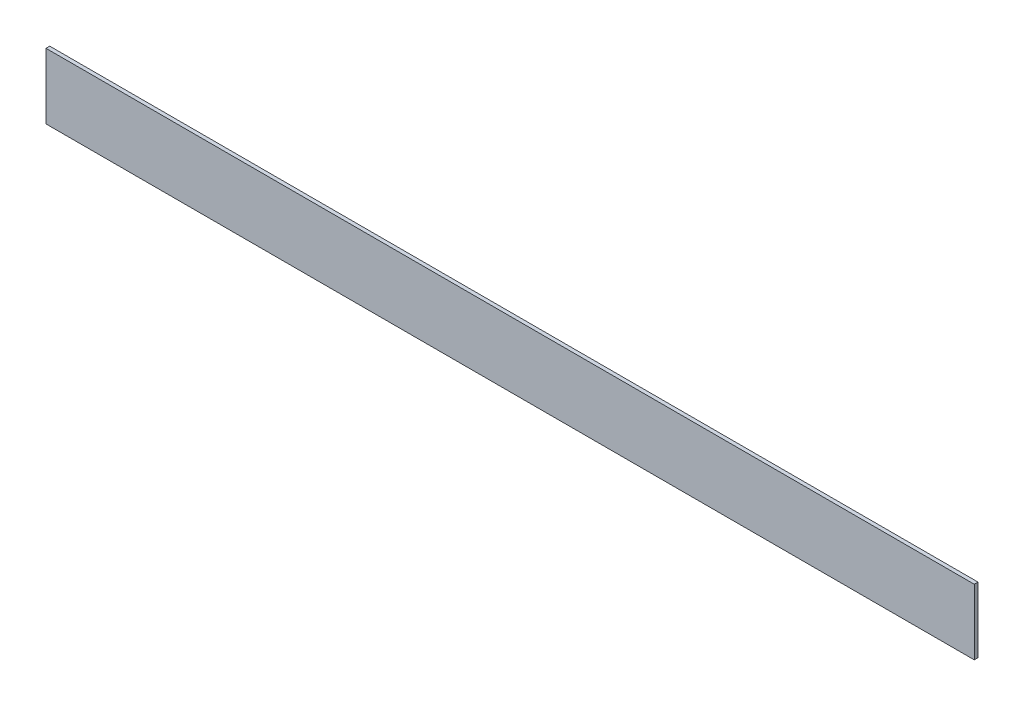
ISO-10303-21;
HEADER;
FILE_DESCRIPTION(('STEP AP214'),'2;1');
FILE_NAME('part.step','',(''),(''),'','','');
FILE_SCHEMA(('AUTOMOTIVE_DESIGN { 1 0 10303 214 1 1 1 1 }'));
ENDSEC;
DATA;
#1=APPLICATION_CONTEXT('core data for automotive mechanical design processes');
#2=APPLICATION_PROTOCOL_DEFINITION('international standard','automotive_design',2000,#1);
#3=PRODUCT_CONTEXT('',#1,'mechanical');
#4=PRODUCT('Part','Part','',(#3));
#5=PRODUCT_RELATED_PRODUCT_CATEGORY('part','',(#4));
#6=PRODUCT_DEFINITION_FORMATION('','',#4);
#7=PRODUCT_DEFINITION_CONTEXT('part definition',#1,'design');
#8=PRODUCT_DEFINITION('design','',#6,#7);
#9=PRODUCT_DEFINITION_SHAPE('','',#8);
#10=(LENGTH_UNIT() NAMED_UNIT(*) SI_UNIT(.MILLI.,.METRE.));
#11=(NAMED_UNIT(*) PLANE_ANGLE_UNIT() SI_UNIT($,.RADIAN.));
#12=(NAMED_UNIT(*) SI_UNIT($,.STERADIAN.) SOLID_ANGLE_UNIT());
#13=UNCERTAINTY_MEASURE_WITH_UNIT(LENGTH_MEASURE(1.E-05),#10,'distance_accuracy_value','');
#14=(GEOMETRIC_REPRESENTATION_CONTEXT(3) GLOBAL_UNCERTAINTY_ASSIGNED_CONTEXT((#13)) GLOBAL_UNIT_ASSIGNED_CONTEXT((#10,
#11,#12)) REPRESENTATION_CONTEXT('',''));
#15=CARTESIAN_POINT('',(0.,0.,0.));
#16=DIRECTION('',(0.,0.,1.));
#17=DIRECTION('',(1.,0.,0.));
#18=AXIS2_PLACEMENT_3D('',#15,#16,#17);
#19=CARTESIAN_POINT('',(-94.5,35.,92.5));
#20=DIRECTION('',(0.,0.,1.));
#21=DIRECTION('',(1.,0.,0.));
#22=AXIS2_PLACEMENT_3D('',#19,#20,#21);
#23=PLANE('',#22);
#24=DIRECTION('',(-1.,0.,0.));
#25=VECTOR('',#24,1.);
#26=CARTESIAN_POINT('',(-94.5,0.,92.5));
#27=LINE('',#26,#25);
#28=CARTESIAN_POINT('',(-94.5,0.,92.5));
#29=VERTEX_POINT('',#28);
#30=CARTESIAN_POINT('',(-590.5,0.,92.5000000000001));
#31=VERTEX_POINT('',#30);
#32=EDGE_CURVE('E99',#29,#31,#27,.T.);
#33=ORIENTED_EDGE('',*,*,#32,.T.);
#34=DIRECTION('',(0.,-1.,0.));
#35=VECTOR('',#34,1.);
#36=CARTESIAN_POINT('',(-590.5,35.,92.5000000000001));
#37=LINE('',#36,#35);
#38=CARTESIAN_POINT('',(-590.5,35.,92.5000000000001));
#39=VERTEX_POINT('',#38);
#40=EDGE_CURVE('E11',#39,#31,#37,.T.);
#41=ORIENTED_EDGE('',*,*,#40,.F.);
#42=DIRECTION('',(-1.,0.,0.));
#43=VECTOR('',#42,1.);
#44=CARTESIAN_POINT('',(-94.5,35.,92.5));
#45=LINE('',#44,#43);
#46=CARTESIAN_POINT('',(-94.5,35.,92.5));
#47=VERTEX_POINT('',#46);
#48=EDGE_CURVE('E76',#47,#39,#45,.T.);
#49=ORIENTED_EDGE('',*,*,#48,.F.);
#50=DIRECTION('',(0.,-1.,0.));
#51=VECTOR('',#50,1.);
#52=CARTESIAN_POINT('',(-94.5,35.,92.5));
#53=LINE('',#52,#51);
#54=EDGE_CURVE('E52',#47,#29,#53,.T.);
#55=ORIENTED_EDGE('',*,*,#54,.T.);
#56=EDGE_LOOP('',(#33,#41,#49,#55));
#57=FACE_BOUND('',#56,.T.);
#58=ADVANCED_FACE('F36',(#57),#23,.F.);
#59=CARTESIAN_POINT('',(-590.5,35.,94.5000000000001));
#60=DIRECTION('',(-1.,0.,0.));
#61=DIRECTION('',(0.,0.,1.));
#62=AXIS2_PLACEMENT_3D('',#59,#60,#61);
#63=PLANE('',#62);
#64=DIRECTION('',(0.,0.,-1.));
#65=VECTOR('',#64,1.);
#66=CARTESIAN_POINT('',(-590.5,0.,94.5000000000001));
#67=LINE('',#66,#65);
#68=CARTESIAN_POINT('',(-590.5,0.,94.5000000000001));
#69=VERTEX_POINT('',#68);
#70=EDGE_CURVE('E85',#69,#31,#67,.T.);
#71=ORIENTED_EDGE('',*,*,#70,.F.);
#72=DIRECTION('',(0.,-1.,0.));
#73=VECTOR('',#72,1.);
#74=CARTESIAN_POINT('',(-590.5,35.,94.5000000000001));
#75=LINE('',#74,#73);
#76=CARTESIAN_POINT('',(-590.5,35.,94.5000000000001));
#77=VERTEX_POINT('',#76);
#78=EDGE_CURVE('E44',#77,#69,#75,.T.);
#79=ORIENTED_EDGE('',*,*,#78,.F.);
#80=DIRECTION('',(0.,0.,-1.));
#81=VECTOR('',#80,1.);
#82=CARTESIAN_POINT('',(-590.5,35.,94.5000000000001));
#83=LINE('',#82,#81);
#84=EDGE_CURVE('E83',#77,#39,#83,.T.);
#85=ORIENTED_EDGE('',*,*,#84,.T.);
#86=ORIENTED_EDGE('',*,*,#40,.T.);
#87=EDGE_LOOP('',(#71,#79,#85,#86));
#88=FACE_BOUND('',#87,.T.);
#89=ADVANCED_FACE('F82',(#88),#63,.T.);
#90=CARTESIAN_POINT('',(-94.5,35.,94.5));
#91=DIRECTION('',(0.,0.,1.));
#92=DIRECTION('',(1.,0.,0.));
#93=AXIS2_PLACEMENT_3D('',#90,#91,#92);
#94=PLANE('',#93);
#95=DIRECTION('',(-1.,0.,0.));
#96=VECTOR('',#95,1.);
#97=CARTESIAN_POINT('',(-94.5,0.,94.5));
#98=LINE('',#97,#96);
#99=CARTESIAN_POINT('',(-94.5,0.,94.5));
#100=VERTEX_POINT('',#99);
#101=EDGE_CURVE('E102',#100,#69,#98,.T.);
#102=ORIENTED_EDGE('',*,*,#101,.F.);
#103=DIRECTION('',(0.,-1.,0.));
#104=VECTOR('',#103,1.);
#105=CARTESIAN_POINT('',(-94.5,35.,94.5));
#106=LINE('',#105,#104);
#107=CARTESIAN_POINT('',(-94.5,35.,94.5));
#108=VERTEX_POINT('',#107);
#109=EDGE_CURVE('E65',#108,#100,#106,.T.);
#110=ORIENTED_EDGE('',*,*,#109,.F.);
#111=DIRECTION('',(-1.,0.,0.));
#112=VECTOR('',#111,1.);
#113=CARTESIAN_POINT('',(-94.5,35.,94.5));
#114=LINE('',#113,#112);
#115=EDGE_CURVE('E91',#108,#77,#114,.T.);
#116=ORIENTED_EDGE('',*,*,#115,.T.);
#117=ORIENTED_EDGE('',*,*,#78,.T.);
#118=EDGE_LOOP('',(#102,#110,#116,#117));
#119=FACE_BOUND('',#118,.T.);
#120=ADVANCED_FACE('F93',(#119),#94,.T.);
#121=CARTESIAN_POINT('',(-94.5,35.,92.5));
#122=DIRECTION('',(1.,0.,0.));
#123=DIRECTION('',(0.,0.,-1.));
#124=AXIS2_PLACEMENT_3D('',#121,#122,#123);
#125=PLANE('',#124);
#126=DIRECTION('',(0.,0.,1.));
#127=VECTOR('',#126,1.);
#128=CARTESIAN_POINT('',(-94.5,0.,92.5));
#129=LINE('',#128,#127);
#130=EDGE_CURVE('E104',#29,#100,#129,.T.);
#131=ORIENTED_EDGE('',*,*,#130,.F.);
#132=ORIENTED_EDGE('',*,*,#54,.F.);
#133=DIRECTION('',(0.,0.,1.));
#134=VECTOR('',#133,1.);
#135=CARTESIAN_POINT('',(-94.5,35.,92.5));
#136=LINE('',#135,#134);
#137=EDGE_CURVE('E94',#47,#108,#136,.T.);
#138=ORIENTED_EDGE('',*,*,#137,.T.);
#139=ORIENTED_EDGE('',*,*,#109,.T.);
#140=EDGE_LOOP('',(#131,#132,#138,#139));
#141=FACE_BOUND('',#140,.T.);
#142=ADVANCED_FACE('F110',(#141),#125,.T.);
#143=CARTESIAN_POINT('',(0.,35.,0.));
#144=DIRECTION('',(0.,-1.,0.));
#145=DIRECTION('',(-1.,0.,0.));
#146=AXIS2_PLACEMENT_3D('',#143,#144,#145);
#147=PLANE('',#146);
#148=ORIENTED_EDGE('',*,*,#48,.T.);
#149=ORIENTED_EDGE('',*,*,#84,.F.);
#150=ORIENTED_EDGE('',*,*,#115,.F.);
#151=ORIENTED_EDGE('',*,*,#137,.F.);
#152=EDGE_LOOP('',(#148,#149,#150,#151));
#153=FACE_BOUND('',#152,.T.);
#154=ADVANCED_FACE('F90',(#153),#147,.F.);
#155=CARTESIAN_POINT('',(0.,0.,0.));
#156=DIRECTION('',(0.,-1.,0.));
#157=DIRECTION('',(-1.,0.,0.));
#158=AXIS2_PLACEMENT_3D('',#155,#156,#157);
#159=PLANE('',#158);
#160=ORIENTED_EDGE('',*,*,#32,.F.);
#161=ORIENTED_EDGE('',*,*,#130,.T.);
#162=ORIENTED_EDGE('',*,*,#101,.T.);
#163=ORIENTED_EDGE('',*,*,#70,.T.);
#164=EDGE_LOOP('',(#160,#161,#162,#163));
#165=FACE_BOUND('',#164,.T.);
#166=ADVANCED_FACE('F109',(#165),#159,.T.);
#167=CLOSED_SHELL('',(#58,#89,#120,#142,#154,#166));
#168=MANIFOLD_SOLID_BREP('B2',#167);
#169=ADVANCED_BREP_SHAPE_REPRESENTATION('',(#18,#168),#14);
#170=SHAPE_DEFINITION_REPRESENTATION(#9,#169);
ENDSEC;
END-ISO-10303-21;
